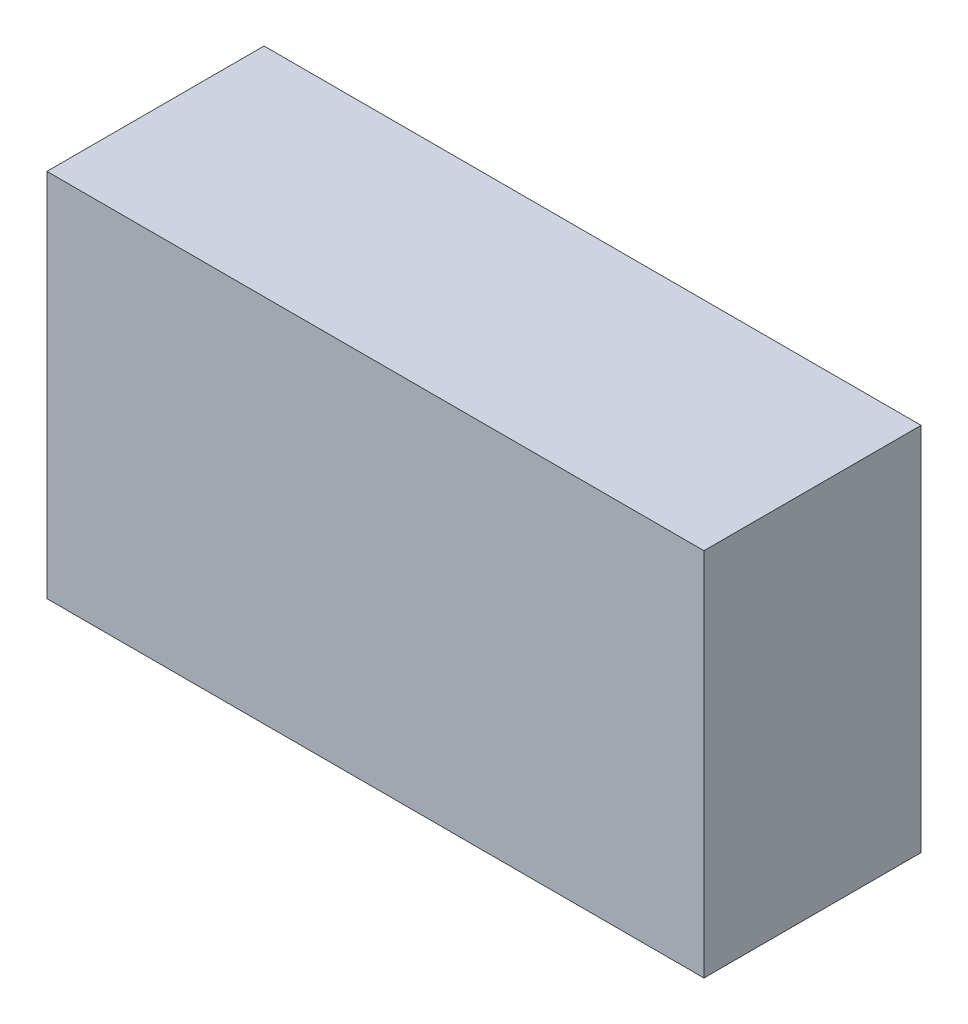
ISO-10303-21;
HEADER;
FILE_DESCRIPTION(('STEP AP214'),'2;1');
FILE_NAME('part.step','',(''),(''),'','','');
FILE_SCHEMA(('AUTOMOTIVE_DESIGN { 1 0 10303 214 1 1 1 1 }'));
ENDSEC;
DATA;
#1=APPLICATION_CONTEXT('core data for automotive mechanical design processes');
#2=APPLICATION_PROTOCOL_DEFINITION('international standard','automotive_design',2000,#1);
#3=PRODUCT_CONTEXT('',#1,'mechanical');
#4=PRODUCT('Part','Part','',(#3));
#5=PRODUCT_RELATED_PRODUCT_CATEGORY('part','',(#4));
#6=PRODUCT_DEFINITION_FORMATION('','',#4);
#7=PRODUCT_DEFINITION_CONTEXT('part definition',#1,'design');
#8=PRODUCT_DEFINITION('design','',#6,#7);
#9=PRODUCT_DEFINITION_SHAPE('','',#8);
#10=(LENGTH_UNIT() NAMED_UNIT(*) SI_UNIT(.MILLI.,.METRE.));
#11=(NAMED_UNIT(*) PLANE_ANGLE_UNIT() SI_UNIT($,.RADIAN.));
#12=(NAMED_UNIT(*) SI_UNIT($,.STERADIAN.) SOLID_ANGLE_UNIT());
#13=UNCERTAINTY_MEASURE_WITH_UNIT(LENGTH_MEASURE(1.E-05),#10,'distance_accuracy_value','');
#14=(GEOMETRIC_REPRESENTATION_CONTEXT(3) GLOBAL_UNCERTAINTY_ASSIGNED_CONTEXT((#13)) GLOBAL_UNIT_ASSIGNED_CONTEXT((#10,
#11,#12)) REPRESENTATION_CONTEXT('',''));
#15=CARTESIAN_POINT('',(0.,0.,0.));
#16=DIRECTION('',(0.,0.,1.));
#17=DIRECTION('',(1.,0.,0.));
#18=AXIS2_PLACEMENT_3D('',#15,#16,#17);
#19=CARTESIAN_POINT('',(68.7,-111.,258.875));
#20=DIRECTION('',(0.,0.,1.));
#21=DIRECTION('',(1.,0.,0.));
#22=AXIS2_PLACEMENT_3D('',#19,#20,#21);
#23=PLANE('',#22);
#24=DIRECTION('',(-1.,0.,0.));
#25=VECTOR('',#24,1.);
#26=CARTESIAN_POINT('',(68.7,-111.,258.875));
#27=LINE('',#26,#25);
#28=CARTESIAN_POINT('',(68.7,-111.,258.875));
#29=VERTEX_POINT('',#28);
#30=CARTESIAN_POINT('',(51.3,-111.,258.875));
#31=VERTEX_POINT('',#30);
#32=EDGE_CURVE('E69',#29,#31,#27,.T.);
#33=ORIENTED_EDGE('',*,*,#32,.F.);
#34=DIRECTION('',(0.,1.,0.));
#35=VECTOR('',#34,1.);
#36=CARTESIAN_POINT('',(68.7,-111.,258.875));
#37=LINE('',#36,#35);
#38=CARTESIAN_POINT('',(68.7,-101.2,258.875));
#39=VERTEX_POINT('',#38);
#40=EDGE_CURVE('E110',#29,#39,#37,.T.);
#41=ORIENTED_EDGE('',*,*,#40,.T.);
#42=DIRECTION('',(-1.,0.,0.));
#43=VECTOR('',#42,1.);
#44=CARTESIAN_POINT('',(68.7,-101.2,258.875));
#45=LINE('',#44,#43);
#46=CARTESIAN_POINT('',(51.3,-101.2,258.875));
#47=VERTEX_POINT('',#46);
#48=EDGE_CURVE('E71',#39,#47,#45,.T.);
#49=ORIENTED_EDGE('',*,*,#48,.T.);
#50=DIRECTION('',(0.,1.,0.));
#51=VECTOR('',#50,1.);
#52=CARTESIAN_POINT('',(51.3,-111.,258.875));
#53=LINE('',#52,#51);
#54=EDGE_CURVE('E10',#31,#47,#53,.T.);
#55=ORIENTED_EDGE('',*,*,#54,.F.);
#56=EDGE_LOOP('',(#33,#41,#49,#55));
#57=FACE_BOUND('',#56,.T.);
#58=ADVANCED_FACE('F15',(#57),#23,.T.);
#59=CARTESIAN_POINT('',(68.7,-111.,253.125));
#60=DIRECTION('',(0.,0.,1.));
#61=DIRECTION('',(1.,0.,0.));
#62=AXIS2_PLACEMENT_3D('',#59,#60,#61);
#63=PLANE('',#62);
#64=DIRECTION('',(0.,1.,0.));
#65=VECTOR('',#64,1.);
#66=CARTESIAN_POINT('',(51.3,-111.,253.125));
#67=LINE('',#66,#65);
#68=CARTESIAN_POINT('',(51.3,-111.,253.125));
#69=VERTEX_POINT('',#68);
#70=CARTESIAN_POINT('',(51.3,-101.2,253.125));
#71=VERTEX_POINT('',#70);
#72=EDGE_CURVE('E26',#69,#71,#67,.T.);
#73=ORIENTED_EDGE('',*,*,#72,.T.);
#74=DIRECTION('',(-1.,0.,0.));
#75=VECTOR('',#74,1.);
#76=CARTESIAN_POINT('',(68.7,-101.2,253.125));
#77=LINE('',#76,#75);
#78=CARTESIAN_POINT('',(68.7,-101.2,253.125));
#79=VERTEX_POINT('',#78);
#80=EDGE_CURVE('E91',#79,#71,#77,.T.);
#81=ORIENTED_EDGE('',*,*,#80,.F.);
#82=DIRECTION('',(0.,1.,0.));
#83=VECTOR('',#82,1.);
#84=CARTESIAN_POINT('',(68.7,-111.,253.125));
#85=LINE('',#84,#83);
#86=CARTESIAN_POINT('',(68.7,-111.,253.125));
#87=VERTEX_POINT('',#86);
#88=EDGE_CURVE('E109',#87,#79,#85,.T.);
#89=ORIENTED_EDGE('',*,*,#88,.F.);
#90=DIRECTION('',(-1.,0.,0.));
#91=VECTOR('',#90,1.);
#92=CARTESIAN_POINT('',(68.7,-111.,253.125));
#93=LINE('',#92,#91);
#94=EDGE_CURVE('E78',#87,#69,#93,.T.);
#95=ORIENTED_EDGE('',*,*,#94,.T.);
#96=EDGE_LOOP('',(#73,#81,#89,#95));
#97=FACE_BOUND('',#96,.T.);
#98=ADVANCED_FACE('F125',(#97),#63,.F.);
#99=CARTESIAN_POINT('',(51.3,-111.,253.125));
#100=DIRECTION('',(-1.,0.,0.));
#101=DIRECTION('',(0.,0.,1.));
#102=AXIS2_PLACEMENT_3D('',#99,#100,#101);
#103=PLANE('',#102);
#104=ORIENTED_EDGE('',*,*,#72,.F.);
#105=DIRECTION('',(0.,0.,1.));
#106=VECTOR('',#105,1.);
#107=CARTESIAN_POINT('',(51.3,-111.,253.125));
#108=LINE('',#107,#106);
#109=EDGE_CURVE('E74',#69,#31,#108,.T.);
#110=ORIENTED_EDGE('',*,*,#109,.T.);
#111=ORIENTED_EDGE('',*,*,#54,.T.);
#112=DIRECTION('',(0.,0.,1.));
#113=VECTOR('',#112,1.);
#114=CARTESIAN_POINT('',(51.3,-101.2,253.125));
#115=LINE('',#114,#113);
#116=EDGE_CURVE('E19',#71,#47,#115,.T.);
#117=ORIENTED_EDGE('',*,*,#116,.F.);
#118=EDGE_LOOP('',(#104,#110,#111,#117));
#119=FACE_BOUND('',#118,.T.);
#120=ADVANCED_FACE('F17',(#119),#103,.T.);
#121=CARTESIAN_POINT('',(68.7,-111.,253.125));
#122=DIRECTION('',(-1.,0.,0.));
#123=DIRECTION('',(0.,0.,1.));
#124=AXIS2_PLACEMENT_3D('',#121,#122,#123);
#125=PLANE('',#124);
#126=DIRECTION('',(0.,0.,1.));
#127=VECTOR('',#126,1.);
#128=CARTESIAN_POINT('',(68.7,-101.2,253.125));
#129=LINE('',#128,#127);
#130=EDGE_CURVE('E89',#79,#39,#129,.T.);
#131=ORIENTED_EDGE('',*,*,#130,.T.);
#132=ORIENTED_EDGE('',*,*,#40,.F.);
#133=DIRECTION('',(0.,0.,1.));
#134=VECTOR('',#133,1.);
#135=CARTESIAN_POINT('',(68.7,-111.,253.125));
#136=LINE('',#135,#134);
#137=EDGE_CURVE('E83',#87,#29,#136,.T.);
#138=ORIENTED_EDGE('',*,*,#137,.F.);
#139=ORIENTED_EDGE('',*,*,#88,.T.);
#140=EDGE_LOOP('',(#131,#132,#138,#139));
#141=FACE_BOUND('',#140,.T.);
#142=ADVANCED_FACE('F123',(#141),#125,.F.);
#143=CARTESIAN_POINT('',(68.7,-101.2,253.125));
#144=DIRECTION('',(0.,1.,0.));
#145=DIRECTION('',(1.,0.,0.));
#146=AXIS2_PLACEMENT_3D('',#143,#144,#145);
#147=PLANE('',#146);
#148=ORIENTED_EDGE('',*,*,#130,.F.);
#149=ORIENTED_EDGE('',*,*,#80,.T.);
#150=ORIENTED_EDGE('',*,*,#116,.T.);
#151=ORIENTED_EDGE('',*,*,#48,.F.);
#152=EDGE_LOOP('',(#148,#149,#150,#151));
#153=FACE_BOUND('',#152,.T.);
#154=ADVANCED_FACE('F126',(#153),#147,.T.);
#155=CARTESIAN_POINT('',(68.7,-111.,253.125));
#156=DIRECTION('',(0.,1.,0.));
#157=DIRECTION('',(1.,0.,0.));
#158=AXIS2_PLACEMENT_3D('',#155,#156,#157);
#159=PLANE('',#158);
#160=ORIENTED_EDGE('',*,*,#32,.T.);
#161=ORIENTED_EDGE('',*,*,#109,.F.);
#162=ORIENTED_EDGE('',*,*,#94,.F.);
#163=ORIENTED_EDGE('',*,*,#137,.T.);
#164=EDGE_LOOP('',(#160,#161,#162,#163));
#165=FACE_BOUND('',#164,.T.);
#166=ADVANCED_FACE('F81',(#165),#159,.F.);
#167=CLOSED_SHELL('',(#58,#98,#120,#142,#154,#166));
#168=MANIFOLD_SOLID_BREP('B1',#167);
#169=ADVANCED_BREP_SHAPE_REPRESENTATION('',(#18,#168),#14);
#170=SHAPE_DEFINITION_REPRESENTATION(#9,#169);
ENDSEC;
END-ISO-10303-21;
